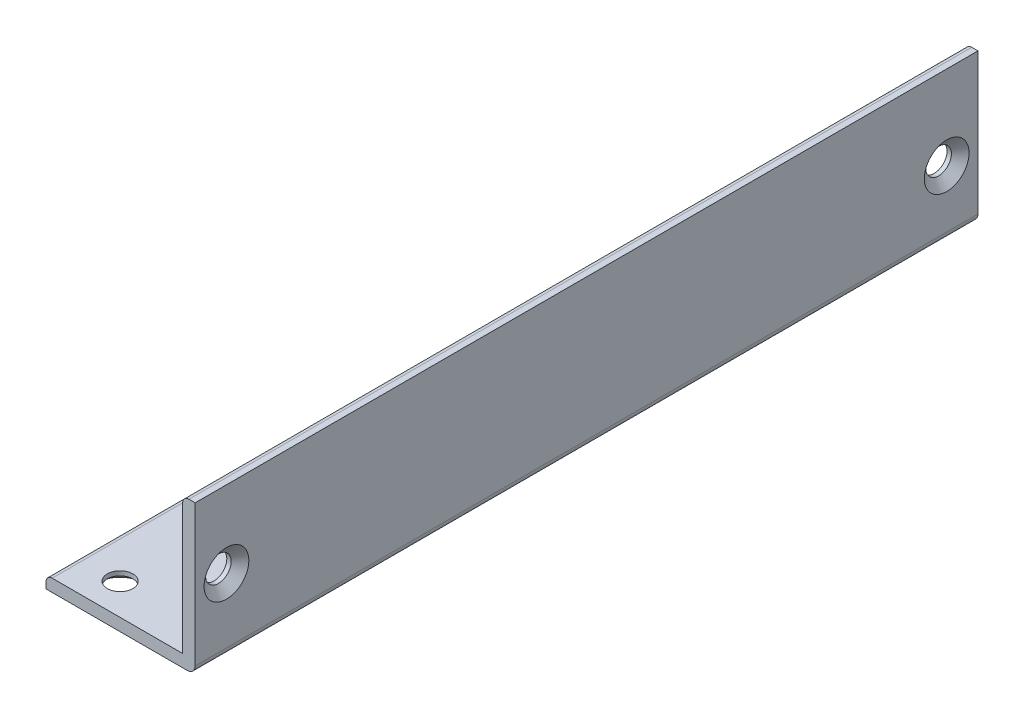
ISO-10303-21;
HEADER;
FILE_DESCRIPTION(('STEP AP214'),'2;1');
FILE_NAME('part.step','',(''),(''),'','','');
FILE_SCHEMA(('AUTOMOTIVE_DESIGN { 1 0 10303 214 1 1 1 1 }'));
ENDSEC;
DATA;
#1=APPLICATION_CONTEXT('core data for automotive mechanical design processes');
#2=APPLICATION_PROTOCOL_DEFINITION('international standard','automotive_design',2000,#1);
#3=PRODUCT_CONTEXT('',#1,'mechanical');
#4=PRODUCT('Part','Part','',(#3));
#5=PRODUCT_RELATED_PRODUCT_CATEGORY('part','',(#4));
#6=PRODUCT_DEFINITION_FORMATION('','',#4);
#7=PRODUCT_DEFINITION_CONTEXT('part definition',#1,'design');
#8=PRODUCT_DEFINITION('design','',#6,#7);
#9=PRODUCT_DEFINITION_SHAPE('','',#8);
#10=(LENGTH_UNIT() NAMED_UNIT(*) SI_UNIT(.MILLI.,.METRE.));
#11=(NAMED_UNIT(*) PLANE_ANGLE_UNIT() SI_UNIT($,.RADIAN.));
#12=(NAMED_UNIT(*) SI_UNIT($,.STERADIAN.) SOLID_ANGLE_UNIT());
#13=UNCERTAINTY_MEASURE_WITH_UNIT(LENGTH_MEASURE(1.E-05),#10,'distance_accuracy_value','');
#14=(GEOMETRIC_REPRESENTATION_CONTEXT(3) GLOBAL_UNCERTAINTY_ASSIGNED_CONTEXT((#13)) GLOBAL_UNIT_ASSIGNED_CONTEXT((#10,
#11,#12)) REPRESENTATION_CONTEXT('',''));
#15=CARTESIAN_POINT('',(0.,0.,0.));
#16=DIRECTION('',(0.,0.,1.));
#17=DIRECTION('',(1.,0.,0.));
#18=AXIS2_PLACEMENT_3D('',#15,#16,#17);
#19=CARTESIAN_POINT('',(8.73124999999998,18.25625,50.));
#20=DIRECTION('',(0.,0.,-1.));
#21=DIRECTION('',(-1.,0.,0.));
#22=AXIS2_PLACEMENT_3D('',#19,#20,#21);
#23=PLANE('',#22);
#24=DIRECTION('',(0.,-1.,0.));
#25=VECTOR('',#24,1.);
#26=CARTESIAN_POINT('',(7.93749999999998,18.25625,50.));
#27=LINE('',#26,#25);
#28=CARTESIAN_POINT('',(7.93749999999998,18.25625,50.));
#29=VERTEX_POINT('',#28);
#30=CARTESIAN_POINT('',(7.93749999999998,1.5875,50.));
#31=VERTEX_POINT('',#30);
#32=EDGE_CURVE('E235',#29,#31,#27,.T.);
#33=ORIENTED_EDGE('',*,*,#32,.T.);
#34=DIRECTION('',(-1.,0.,0.));
#35=VECTOR('',#34,1.);
#36=CARTESIAN_POINT('',(7.14374999999999,1.5875,50.));
#37=LINE('',#36,#35);
#38=CARTESIAN_POINT('',(-8.73125000000002,1.5875,50.));
#39=VERTEX_POINT('',#38);
#40=EDGE_CURVE('E157',#31,#39,#37,.T.);
#41=ORIENTED_EDGE('',*,*,#40,.T.);
#42=CARTESIAN_POINT('',(-8.73125000000002,0.793749999999998,50.));
#43=DIRECTION('',(0.,0.,1.));
#44=DIRECTION('',(-1.,0.,0.));
#45=AXIS2_PLACEMENT_3D('',#42,#43,#44);
#46=CIRCLE('',#45,0.793749999999998);
#47=CARTESIAN_POINT('',(-9.52500000000002,0.793749999999998,50.));
#48=VERTEX_POINT('',#47);
#49=EDGE_CURVE('E238',#39,#48,#46,.T.);
#50=ORIENTED_EDGE('',*,*,#49,.T.);
#51=DIRECTION('',(0.,-1.,0.));
#52=VECTOR('',#51,1.);
#53=CARTESIAN_POINT('',(-9.52500000000002,0.793749999999998,50.));
#54=LINE('',#53,#52);
#55=CARTESIAN_POINT('',(-9.52500000000002,0.,50.));
#56=VERTEX_POINT('',#55);
#57=EDGE_CURVE('E219',#48,#56,#54,.T.);
#58=ORIENTED_EDGE('',*,*,#57,.T.);
#59=DIRECTION('',(1.,0.,0.));
#60=VECTOR('',#59,1.);
#61=CARTESIAN_POINT('',(-9.52500000000002,0.,50.));
#62=LINE('',#61,#60);
#63=CARTESIAN_POINT('',(8.52499999999998,0.,50.));
#64=VERTEX_POINT('',#63);
#65=EDGE_CURVE('E222',#56,#64,#62,.T.);
#66=ORIENTED_EDGE('',*,*,#65,.T.);
#67=CARTESIAN_POINT('',(8.52499999999998,1.,50.));
#68=DIRECTION('',(0.,0.,-1.));
#69=DIRECTION('',(-1.,0.,0.));
#70=AXIS2_PLACEMENT_3D('',#67,#68,#69);
#71=CIRCLE('',#70,1.);
#72=CARTESIAN_POINT('',(9.52499999999998,1.,50.));
#73=VERTEX_POINT('',#72);
#74=EDGE_CURVE('E12',#64,#73,#71,.F.);
#75=ORIENTED_EDGE('',*,*,#74,.T.);
#76=DIRECTION('',(0.,1.,0.));
#77=VECTOR('',#76,1.);
#78=CARTESIAN_POINT('',(9.52499999999998,0.,50.));
#79=LINE('',#78,#77);
#80=CARTESIAN_POINT('',(9.52499999999998,19.05,50.));
#81=VERTEX_POINT('',#80);
#82=EDGE_CURVE('E226',#73,#81,#79,.T.);
#83=ORIENTED_EDGE('',*,*,#82,.T.);
#84=DIRECTION('',(-1.,0.,0.));
#85=VECTOR('',#84,1.);
#86=CARTESIAN_POINT('',(8.73124999999998,19.05,50.));
#87=LINE('',#86,#85);
#88=CARTESIAN_POINT('',(8.73124999999998,19.05,50.));
#89=VERTEX_POINT('',#88);
#90=EDGE_CURVE('E229',#81,#89,#87,.T.);
#91=ORIENTED_EDGE('',*,*,#90,.T.);
#92=CARTESIAN_POINT('',(8.73124999999998,18.25625,50.));
#93=DIRECTION('',(0.,0.,1.));
#94=DIRECTION('',(-1.,0.,0.));
#95=AXIS2_PLACEMENT_3D('',#92,#93,#94);
#96=CIRCLE('',#95,0.793749999999999);
#97=EDGE_CURVE('E232',#89,#29,#96,.T.);
#98=ORIENTED_EDGE('',*,*,#97,.T.);
#99=EDGE_LOOP('',(#33,#41,#50,#58,#66,#75,#83,#91,#98));
#100=FACE_BOUND('',#99,.T.);
#101=ADVANCED_FACE('F44',(#100),#23,.F.);
#102=CARTESIAN_POINT('',(-9.52500000000002,0.793749999999998,50.));
#103=DIRECTION('',(1.,0.,0.));
#104=DIRECTION('',(0.,0.,-1.));
#105=AXIS2_PLACEMENT_3D('',#102,#103,#104);
#106=PLANE('',#105);
#107=DIRECTION('',(0.,-1.,0.));
#108=VECTOR('',#107,1.);
#109=CARTESIAN_POINT('',(-9.52499999999998,0.793749999999998,-50.));
#110=LINE('',#109,#108);
#111=CARTESIAN_POINT('',(-9.52499999999998,0.793749999999998,-50.));
#112=VERTEX_POINT('',#111);
#113=CARTESIAN_POINT('',(-9.52499999999998,0.,-50.));
#114=VERTEX_POINT('',#113);
#115=EDGE_CURVE('E242',#112,#114,#110,.T.);
#116=ORIENTED_EDGE('',*,*,#115,.T.);
#117=DIRECTION('',(0.,0.,-1.));
#118=VECTOR('',#117,1.);
#119=CARTESIAN_POINT('',(-9.52500000000002,0.,50.));
#120=LINE('',#119,#118);
#121=EDGE_CURVE('E280',#56,#114,#120,.T.);
#122=ORIENTED_EDGE('',*,*,#121,.F.);
#123=ORIENTED_EDGE('',*,*,#57,.F.);
#124=DIRECTION('',(0.,0.,-1.));
#125=VECTOR('',#124,1.);
#126=CARTESIAN_POINT('',(-9.52500000000002,0.793749999999998,50.));
#127=LINE('',#126,#125);
#128=EDGE_CURVE('E241',#48,#112,#127,.T.);
#129=ORIENTED_EDGE('',*,*,#128,.T.);
#130=EDGE_LOOP('',(#116,#122,#123,#129));
#131=FACE_BOUND('',#130,.T.);
#132=ADVANCED_FACE('F308',(#131),#106,.F.);
#133=CARTESIAN_POINT('',(-9.52500000000002,0.,50.));
#134=DIRECTION('',(0.,1.,0.));
#135=DIRECTION('',(0.,0.,1.));
#136=AXIS2_PLACEMENT_3D('',#133,#134,#135);
#137=PLANE('',#136);
#138=CARTESIAN_POINT('',(3.49374999999999,0.,29.88));
#139=DIRECTION('',(0.,1.,0.));
#140=DIRECTION('',(0.,0.,1.));
#141=AXIS2_PLACEMENT_3D('',#138,#139,#140);
#142=CIRCLE('',#141,2.0574);
#143=CARTESIAN_POINT('',(3.49374999999999,0.,31.9374));
#144=VERTEX_POINT('',#143);
#145=EDGE_CURVE('E173',#144,#144,#142,.T.);
#146=ORIENTED_EDGE('',*,*,#145,.T.);
#147=EDGE_LOOP('',(#146));
#148=FACE_BOUND('',#147,.T.);
#149=CARTESIAN_POINT('',(-1.30625000000001,0.,29.88));
#150=DIRECTION('',(0.,1.,0.));
#151=DIRECTION('',(0.,0.,1.));
#152=AXIS2_PLACEMENT_3D('',#149,#150,#151);
#153=CIRCLE('',#152,2.0574);
#154=CARTESIAN_POINT('',(-1.30625000000001,0.,31.9374));
#155=VERTEX_POINT('',#154);
#156=EDGE_CURVE('E182',#155,#155,#153,.T.);
#157=ORIENTED_EDGE('',*,*,#156,.T.);
#158=EDGE_LOOP('',(#157));
#159=FACE_BOUND('',#158,.T.);
#160=CARTESIAN_POINT('',(-4.06250000000003,0.,46.));
#161=DIRECTION('',(0.,-1.,0.));
#162=DIRECTION('',(0.,0.,-1.));
#163=AXIS2_PLACEMENT_3D('',#160,#161,#162);
#164=CIRCLE('',#163,2.8575);
#165=CARTESIAN_POINT('',(-4.06250000000002,0.,43.1425));
#166=VERTEX_POINT('',#165);
#167=EDGE_CURVE('E205',#166,#166,#164,.T.);
#168=ORIENTED_EDGE('',*,*,#167,.F.);
#169=EDGE_LOOP('',(#168));
#170=FACE_BOUND('',#169,.T.);
#171=CARTESIAN_POINT('',(-4.06249999999998,0.,-46.));
#172=DIRECTION('',(0.,-1.,0.));
#173=DIRECTION('',(0.,0.,-1.));
#174=AXIS2_PLACEMENT_3D('',#171,#172,#173);
#175=CIRCLE('',#174,2.8575);
#176=CARTESIAN_POINT('',(-4.06249999999998,0.,-48.8575));
#177=VERTEX_POINT('',#176);
#178=EDGE_CURVE('E212',#177,#177,#175,.T.);
#179=ORIENTED_EDGE('',*,*,#178,.F.);
#180=EDGE_LOOP('',(#179));
#181=FACE_BOUND('',#180,.T.);
#182=DIRECTION('',(1.,0.,0.));
#183=VECTOR('',#182,1.);
#184=CARTESIAN_POINT('',(-9.52499999999998,0.,-50.));
#185=LINE('',#184,#183);
#186=CARTESIAN_POINT('',(8.52500000000002,0.,-50.));
#187=VERTEX_POINT('',#186);
#188=EDGE_CURVE('E245',#114,#187,#185,.T.);
#189=ORIENTED_EDGE('',*,*,#188,.T.);
#190=DIRECTION('',(0.,0.,-1.));
#191=VECTOR('',#190,1.);
#192=CARTESIAN_POINT('',(8.52499999999998,0.,50.));
#193=LINE('',#192,#191);
#194=EDGE_CURVE('E52',#187,#64,#193,.F.);
#195=ORIENTED_EDGE('',*,*,#194,.T.);
#196=ORIENTED_EDGE('',*,*,#65,.F.);
#197=ORIENTED_EDGE('',*,*,#121,.T.);
#198=EDGE_LOOP('',(#189,#195,#196,#197));
#199=FACE_BOUND('',#198,.T.);
#200=ADVANCED_FACE('F305',(#148,#159,#170,#181,#199),#137,.F.);
#201=CARTESIAN_POINT('',(9.52499999999998,0.,50.));
#202=DIRECTION('',(-1.,0.,0.));
#203=DIRECTION('',(0.,0.,1.));
#204=AXIS2_PLACEMENT_3D('',#201,#202,#203);
#205=PLANE('',#204);
#206=CARTESIAN_POINT('',(9.52499999999998,9.25,46.));
#207=DIRECTION('',(1.,0.,0.));
#208=DIRECTION('',(0.,0.,-1.));
#209=AXIS2_PLACEMENT_3D('',#206,#207,#208);
#210=CIRCLE('',#209,2.8575);
#211=CARTESIAN_POINT('',(9.52499999999998,9.25,43.1425));
#212=VERTEX_POINT('',#211);
#213=EDGE_CURVE('E191',#212,#212,#210,.T.);
#214=ORIENTED_EDGE('',*,*,#213,.F.);
#215=EDGE_LOOP('',(#214));
#216=FACE_BOUND('',#215,.T.);
#217=CARTESIAN_POINT('',(9.52500000000002,8.34,-46.));
#218=DIRECTION('',(1.,0.,0.));
#219=DIRECTION('',(0.,0.,-1.));
#220=AXIS2_PLACEMENT_3D('',#217,#218,#219);
#221=CIRCLE('',#220,2.8575);
#222=CARTESIAN_POINT('',(9.52500000000002,8.34,-48.8575));
#223=VERTEX_POINT('',#222);
#224=EDGE_CURVE('E198',#223,#223,#221,.T.);
#225=ORIENTED_EDGE('',*,*,#224,.F.);
#226=EDGE_LOOP('',(#225));
#227=FACE_BOUND('',#226,.T.);
#228=ORIENTED_EDGE('',*,*,#82,.F.);
#229=DIRECTION('',(0.,0.,-1.));
#230=VECTOR('',#229,1.);
#231=CARTESIAN_POINT('',(9.52499999999998,1.,50.));
#232=LINE('',#231,#230);
#233=CARTESIAN_POINT('',(9.52500000000002,1.,-50.));
#234=VERTEX_POINT('',#233);
#235=EDGE_CURVE('E283',#73,#234,#232,.T.);
#236=ORIENTED_EDGE('',*,*,#235,.T.);
#237=DIRECTION('',(0.,1.,0.));
#238=VECTOR('',#237,1.);
#239=CARTESIAN_POINT('',(9.52500000000002,0.,-50.));
#240=LINE('',#239,#238);
#241=CARTESIAN_POINT('',(9.52500000000002,19.05,-50.));
#242=VERTEX_POINT('',#241);
#243=EDGE_CURVE('E247',#234,#242,#240,.T.);
#244=ORIENTED_EDGE('',*,*,#243,.T.);
#245=DIRECTION('',(0.,0.,-1.));
#246=VECTOR('',#245,1.);
#247=CARTESIAN_POINT('',(9.52499999999998,19.05,50.));
#248=LINE('',#247,#246);
#249=EDGE_CURVE('E277',#81,#242,#248,.T.);
#250=ORIENTED_EDGE('',*,*,#249,.F.);
#251=EDGE_LOOP('',(#228,#236,#244,#250));
#252=FACE_BOUND('',#251,.T.);
#253=ADVANCED_FACE('F296',(#216,#227,#252),#205,.F.);
#254=CARTESIAN_POINT('',(8.73124999999998,19.05,50.));
#255=DIRECTION('',(0.,-1.,0.));
#256=DIRECTION('',(0.,0.,-1.));
#257=AXIS2_PLACEMENT_3D('',#254,#255,#256);
#258=PLANE('',#257);
#259=DIRECTION('',(-1.,0.,0.));
#260=VECTOR('',#259,1.);
#261=CARTESIAN_POINT('',(8.73125000000002,19.05,-50.));
#262=LINE('',#261,#260);
#263=CARTESIAN_POINT('',(8.73125000000002,19.05,-50.));
#264=VERTEX_POINT('',#263);
#265=EDGE_CURVE('E250',#242,#264,#262,.T.);
#266=ORIENTED_EDGE('',*,*,#265,.T.);
#267=DIRECTION('',(0.,0.,-1.));
#268=VECTOR('',#267,1.);
#269=CARTESIAN_POINT('',(8.73124999999998,19.05,50.));
#270=LINE('',#269,#268);
#271=EDGE_CURVE('E274',#89,#264,#270,.T.);
#272=ORIENTED_EDGE('',*,*,#271,.F.);
#273=ORIENTED_EDGE('',*,*,#90,.F.);
#274=ORIENTED_EDGE('',*,*,#249,.T.);
#275=EDGE_LOOP('',(#266,#272,#273,#274));
#276=FACE_BOUND('',#275,.T.);
#277=ADVANCED_FACE('F301',(#276),#258,.F.);
#278=CARTESIAN_POINT('',(8.73124999999998,18.25625,50.));
#279=DIRECTION('',(0.,0.,-1.));
#280=DIRECTION('',(-1.,0.,0.));
#281=AXIS2_PLACEMENT_3D('',#278,#279,#280);
#282=CYLINDRICAL_SURFACE('',#281,0.793749999999999);
#283=CARTESIAN_POINT('',(8.73125000000002,18.25625,-50.));
#284=DIRECTION('',(0.,0.,1.));
#285=DIRECTION('',(-1.,0.,0.));
#286=AXIS2_PLACEMENT_3D('',#283,#284,#285);
#287=CIRCLE('',#286,0.793749999999999);
#288=CARTESIAN_POINT('',(7.93750000000002,18.25625,-50.));
#289=VERTEX_POINT('',#288);
#290=EDGE_CURVE('E253',#264,#289,#287,.T.);
#291=ORIENTED_EDGE('',*,*,#290,.T.);
#292=DIRECTION('',(0.,0.,-1.));
#293=VECTOR('',#292,1.);
#294=CARTESIAN_POINT('',(7.93749999999998,18.25625,50.));
#295=LINE('',#294,#293);
#296=EDGE_CURVE('E271',#29,#289,#295,.T.);
#297=ORIENTED_EDGE('',*,*,#296,.F.);
#298=ORIENTED_EDGE('',*,*,#97,.F.);
#299=ORIENTED_EDGE('',*,*,#271,.T.);
#300=EDGE_LOOP('',(#291,#297,#298,#299));
#301=FACE_BOUND('',#300,.T.);
#302=ADVANCED_FACE('F314',(#301),#282,.T.);
#303=CARTESIAN_POINT('',(7.93749999999998,18.25625,50.));
#304=DIRECTION('',(1.,0.,0.));
#305=DIRECTION('',(0.,1.,0.));
#306=AXIS2_PLACEMENT_3D('',#303,#304,#305);
#307=PLANE('',#306);
#308=DIRECTION('',(0.,0.,1.));
#309=VECTOR('',#308,1.);
#310=CARTESIAN_POINT('',(7.93749999999999,1.5875,25.));
#311=LINE('',#310,#309);
#312=CARTESIAN_POINT('',(7.93749999999999,1.5875,25.));
#313=VERTEX_POINT('',#312);
#314=EDGE_CURVE('E148',#313,#31,#311,.T.);
#315=ORIENTED_EDGE('',*,*,#314,.T.);
#316=ORIENTED_EDGE('',*,*,#32,.F.);
#317=ORIENTED_EDGE('',*,*,#296,.T.);
#318=DIRECTION('',(0.,-1.,0.));
#319=VECTOR('',#318,1.);
#320=CARTESIAN_POINT('',(7.93750000000002,18.25625,-50.));
#321=LINE('',#320,#319);
#322=CARTESIAN_POINT('',(7.93750000000003,1.5875,-50.));
#323=VERTEX_POINT('',#322);
#324=EDGE_CURVE('E256',#289,#323,#321,.T.);
#325=ORIENTED_EDGE('',*,*,#324,.T.);
#326=DIRECTION('',(0.,0.,-1.));
#327=VECTOR('',#326,1.);
#328=CARTESIAN_POINT('',(7.93750000000002,1.5875,-25.));
#329=LINE('',#328,#327);
#330=CARTESIAN_POINT('',(7.93750000000002,1.5875,-25.));
#331=VERTEX_POINT('',#330);
#332=EDGE_CURVE('E167',#331,#323,#329,.T.);
#333=ORIENTED_EDGE('',*,*,#332,.F.);
#334=DIRECTION('',(0.,-1.,0.));
#335=VECTOR('',#334,1.);
#336=CARTESIAN_POINT('',(7.93750000000002,6.5875,-25.));
#337=LINE('',#336,#335);
#338=CARTESIAN_POINT('',(7.93750000000002,2.38125,-25.));
#339=VERTEX_POINT('',#338);
#340=EDGE_CURVE('E160',#339,#331,#337,.T.);
#341=ORIENTED_EDGE('',*,*,#340,.F.);
#342=DIRECTION('',(0.,0.,-1.));
#343=VECTOR('',#342,1.);
#344=CARTESIAN_POINT('',(7.93749999999999,2.38125,50.));
#345=LINE('',#344,#343);
#346=CARTESIAN_POINT('',(7.93749999999999,2.38125,25.));
#347=VERTEX_POINT('',#346);
#348=EDGE_CURVE('E152',#347,#339,#345,.T.);
#349=ORIENTED_EDGE('',*,*,#348,.F.);
#350=DIRECTION('',(0.,-1.,0.));
#351=VECTOR('',#350,1.);
#352=CARTESIAN_POINT('',(7.93749999999999,6.5875,25.));
#353=LINE('',#352,#351);
#354=EDGE_CURVE('E136',#347,#313,#353,.T.);
#355=ORIENTED_EDGE('',*,*,#354,.T.);
#356=EDGE_LOOP('',(#315,#316,#317,#325,#333,#341,#349,#355));
#357=FACE_BOUND('',#356,.T.);
#358=CARTESIAN_POINT('',(7.93750000000003,8.34,-46.));
#359=DIRECTION('',(1.,0.,0.));
#360=DIRECTION('',(0.,1.,0.));
#361=AXIS2_PLACEMENT_3D('',#358,#359,#360);
#362=CIRCLE('',#361,1.63195);
#363=CARTESIAN_POINT('',(7.93750000000003,9.97195,-46.));
#364=VERTEX_POINT('',#363);
#365=EDGE_CURVE('E204',#364,#364,#362,.T.);
#366=ORIENTED_EDGE('',*,*,#365,.T.);
#367=EDGE_LOOP('',(#366));
#368=FACE_BOUND('',#367,.T.);
#369=CARTESIAN_POINT('',(7.93749999999998,9.25,46.));
#370=DIRECTION('',(1.,0.,0.));
#371=DIRECTION('',(0.,1.,0.));
#372=AXIS2_PLACEMENT_3D('',#369,#370,#371);
#373=CIRCLE('',#372,1.63195);
#374=CARTESIAN_POINT('',(7.93749999999998,10.88195,46.));
#375=VERTEX_POINT('',#374);
#376=EDGE_CURVE('E197',#375,#375,#373,.T.);
#377=ORIENTED_EDGE('',*,*,#376,.T.);
#378=EDGE_LOOP('',(#377));
#379=FACE_BOUND('',#378,.T.);
#380=ADVANCED_FACE('F145',(#357,#368,#379),#307,.F.);
#381=CARTESIAN_POINT('',(7.14374999999999,2.38125,50.));
#382=DIRECTION('',(0.,0.,-1.));
#383=DIRECTION('',(-1.,0.,0.));
#384=AXIS2_PLACEMENT_3D('',#381,#382,#383);
#385=CYLINDRICAL_SURFACE('',#384,0.793749999999999);
#386=DIRECTION('',(0.,0.,-1.));
#387=VECTOR('',#386,1.);
#388=CARTESIAN_POINT('',(7.14374999999999,1.5875,50.));
#389=LINE('',#388,#387);
#390=CARTESIAN_POINT('',(7.14375,1.5875,25.));
#391=VERTEX_POINT('',#390);
#392=CARTESIAN_POINT('',(7.14375000000002,1.5875,-25.));
#393=VERTEX_POINT('',#392);
#394=EDGE_CURVE('E268',#391,#393,#389,.T.);
#395=ORIENTED_EDGE('',*,*,#394,.F.);
#396=CARTESIAN_POINT('',(7.14375,2.38125,25.));
#397=DIRECTION('',(0.,0.,-1.));
#398=DIRECTION('',(-1.,0.,0.));
#399=AXIS2_PLACEMENT_3D('',#396,#397,#398);
#400=CIRCLE('',#399,0.793749999999999);
#401=EDGE_CURVE('E138',#391,#347,#400,.F.);
#402=ORIENTED_EDGE('',*,*,#401,.T.);
#403=ORIENTED_EDGE('',*,*,#348,.T.);
#404=CARTESIAN_POINT('',(7.14375000000002,2.38125,-25.));
#405=DIRECTION('',(0.,0.,1.));
#406=DIRECTION('',(1.,0.,0.));
#407=AXIS2_PLACEMENT_3D('',#404,#405,#406);
#408=CIRCLE('',#407,0.793749999999999);
#409=EDGE_CURVE('E170',#339,#393,#408,.F.);
#410=ORIENTED_EDGE('',*,*,#409,.T.);
#411=EDGE_LOOP('',(#395,#402,#403,#410));
#412=FACE_BOUND('',#411,.T.);
#413=ADVANCED_FACE('F321',(#412),#385,.F.);
#414=CARTESIAN_POINT('',(7.14374999999999,1.5875,50.));
#415=DIRECTION('',(0.,-1.,0.));
#416=DIRECTION('',(1.,0.,0.));
#417=AXIS2_PLACEMENT_3D('',#414,#415,#416);
#418=PLANE('',#417);
#419=CARTESIAN_POINT('',(3.49374999999999,1.5875,29.88));
#420=DIRECTION('',(0.,1.,0.));
#421=DIRECTION('',(0.,0.,1.));
#422=AXIS2_PLACEMENT_3D('',#419,#420,#421);
#423=CIRCLE('',#422,1.21919999999999);
#424=CARTESIAN_POINT('',(3.49374999999999,1.5875,31.0992));
#425=VERTEX_POINT('',#424);
#426=EDGE_CURVE('E176',#425,#425,#423,.T.);
#427=ORIENTED_EDGE('',*,*,#426,.F.);
#428=EDGE_LOOP('',(#427));
#429=FACE_BOUND('',#428,.T.);
#430=DIRECTION('',(0.,0.,-1.));
#431=VECTOR('',#430,1.);
#432=CARTESIAN_POINT('',(-8.73125000000002,1.5875,50.));
#433=LINE('',#432,#431);
#434=CARTESIAN_POINT('',(-8.73124999999998,1.5875,-50.));
#435=VERTEX_POINT('',#434);
#436=EDGE_CURVE('E265',#39,#435,#433,.T.);
#437=ORIENTED_EDGE('',*,*,#436,.F.);
#438=ORIENTED_EDGE('',*,*,#40,.F.);
#439=ORIENTED_EDGE('',*,*,#314,.F.);
#440=DIRECTION('',(-1.,0.,0.));
#441=VECTOR('',#440,1.);
#442=CARTESIAN_POINT('',(2.93749999999999,1.5875,25.));
#443=LINE('',#442,#441);
#444=EDGE_CURVE('E133',#313,#391,#443,.T.);
#445=ORIENTED_EDGE('',*,*,#444,.T.);
#446=ORIENTED_EDGE('',*,*,#394,.T.);
#447=DIRECTION('',(-1.,0.,0.));
#448=VECTOR('',#447,1.);
#449=CARTESIAN_POINT('',(2.93750000000001,1.5875,-25.));
#450=LINE('',#449,#448);
#451=EDGE_CURVE('E165',#331,#393,#450,.T.);
#452=ORIENTED_EDGE('',*,*,#451,.F.);
#453=ORIENTED_EDGE('',*,*,#332,.T.);
#454=DIRECTION('',(-1.,0.,0.));
#455=VECTOR('',#454,1.);
#456=CARTESIAN_POINT('',(7.14375000000003,1.5875,-50.));
#457=LINE('',#456,#455);
#458=EDGE_CURVE('E259',#323,#435,#457,.T.);
#459=ORIENTED_EDGE('',*,*,#458,.T.);
#460=EDGE_LOOP('',(#437,#438,#439,#445,#446,#452,#453,#459));
#461=FACE_BOUND('',#460,.T.);
#462=CARTESIAN_POINT('',(-4.06249999999998,1.5875,-46.));
#463=DIRECTION('',(0.,-1.,0.));
#464=DIRECTION('',(1.,0.,0.));
#465=AXIS2_PLACEMENT_3D('',#462,#463,#464);
#466=CIRCLE('',#465,1.63195);
#467=CARTESIAN_POINT('',(-2.43054999999998,1.5875,-46.));
#468=VERTEX_POINT('',#467);
#469=EDGE_CURVE('E218',#468,#468,#466,.T.);
#470=ORIENTED_EDGE('',*,*,#469,.T.);
#471=EDGE_LOOP('',(#470));
#472=FACE_BOUND('',#471,.T.);
#473=CARTESIAN_POINT('',(-4.06250000000003,1.5875,46.));
#474=DIRECTION('',(0.,-1.,0.));
#475=DIRECTION('',(1.,0.,0.));
#476=AXIS2_PLACEMENT_3D('',#473,#474,#475);
#477=CIRCLE('',#476,1.63195);
#478=CARTESIAN_POINT('',(-2.43055000000003,1.5875,46.));
#479=VERTEX_POINT('',#478);
#480=EDGE_CURVE('E211',#479,#479,#477,.T.);
#481=ORIENTED_EDGE('',*,*,#480,.T.);
#482=EDGE_LOOP('',(#481));
#483=FACE_BOUND('',#482,.T.);
#484=CARTESIAN_POINT('',(-1.30625000000001,1.5875,29.88));
#485=DIRECTION('',(0.,1.,0.));
#486=DIRECTION('',(0.,0.,1.));
#487=AXIS2_PLACEMENT_3D('',#484,#485,#486);
#488=CIRCLE('',#487,1.21919999999999);
#489=CARTESIAN_POINT('',(-1.30625000000001,1.5875,31.0992));
#490=VERTEX_POINT('',#489);
#491=EDGE_CURVE('E185',#490,#490,#488,.T.);
#492=ORIENTED_EDGE('',*,*,#491,.F.);
#493=EDGE_LOOP('',(#492));
#494=FACE_BOUND('',#493,.T.);
#495=ADVANCED_FACE('F154',(#429,#461,#472,#483,#494),#418,.F.);
#496=CARTESIAN_POINT('',(-8.73125000000002,0.793749999999998,50.));
#497=DIRECTION('',(0.,0.,-1.));
#498=DIRECTION('',(-1.,0.,0.));
#499=AXIS2_PLACEMENT_3D('',#496,#497,#498);
#500=CYLINDRICAL_SURFACE('',#499,0.793749999999998);
#501=CARTESIAN_POINT('',(-8.73124999999998,0.793749999999998,-50.));
#502=DIRECTION('',(0.,0.,1.));
#503=DIRECTION('',(-1.,0.,0.));
#504=AXIS2_PLACEMENT_3D('',#501,#502,#503);
#505=CIRCLE('',#504,0.793749999999998);
#506=EDGE_CURVE('E223',#435,#112,#505,.T.);
#507=ORIENTED_EDGE('',*,*,#506,.T.);
#508=ORIENTED_EDGE('',*,*,#128,.F.);
#509=ORIENTED_EDGE('',*,*,#49,.F.);
#510=ORIENTED_EDGE('',*,*,#436,.T.);
#511=EDGE_LOOP('',(#507,#508,#509,#510));
#512=FACE_BOUND('',#511,.T.);
#513=ADVANCED_FACE('F312',(#512),#500,.T.);
#514=CARTESIAN_POINT('',(8.73125000000002,18.25625,-50.));
#515=DIRECTION('',(0.,0.,-1.));
#516=DIRECTION('',(-1.,0.,0.));
#517=AXIS2_PLACEMENT_3D('',#514,#515,#516);
#518=PLANE('',#517);
#519=ORIENTED_EDGE('',*,*,#458,.F.);
#520=ORIENTED_EDGE('',*,*,#324,.F.);
#521=ORIENTED_EDGE('',*,*,#290,.F.);
#522=ORIENTED_EDGE('',*,*,#265,.F.);
#523=ORIENTED_EDGE('',*,*,#243,.F.);
#524=CARTESIAN_POINT('',(8.52500000000002,1.,-50.));
#525=DIRECTION('',(0.,0.,-1.));
#526=DIRECTION('',(-1.,0.,0.));
#527=AXIS2_PLACEMENT_3D('',#524,#525,#526);
#528=CIRCLE('',#527,1.);
#529=EDGE_CURVE('E66',#234,#187,#528,.T.);
#530=ORIENTED_EDGE('',*,*,#529,.T.);
#531=ORIENTED_EDGE('',*,*,#188,.F.);
#532=ORIENTED_EDGE('',*,*,#115,.F.);
#533=ORIENTED_EDGE('',*,*,#506,.F.);
#534=EDGE_LOOP('',(#519,#520,#521,#522,#523,#530,#531,#532,#533));
#535=FACE_BOUND('',#534,.T.);
#536=ADVANCED_FACE('F298',(#535),#518,.T.);
#537=CARTESIAN_POINT('',(-4.06249999999998,0.,-46.));
#538=DIRECTION('',(0.,-1.,0.));
#539=DIRECTION('',(0.,0.,-1.));
#540=AXIS2_PLACEMENT_3D('',#537,#538,#539);
#541=CYLINDRICAL_SURFACE('',#540,1.63195);
#542=CARTESIAN_POINT('',(-4.06249999999998,1.02835855298932,-46.));
#543=DIRECTION('',(0.,-1.,0.));
#544=DIRECTION('',(0.,0.,-1.));
#545=AXIS2_PLACEMENT_3D('',#542,#543,#544);
#546=CIRCLE('',#545,1.63195);
#547=CARTESIAN_POINT('',(-4.06249999999998,1.02835855298932,-47.63195));
#548=VERTEX_POINT('',#547);
#549=EDGE_CURVE('E215',#548,#548,#546,.T.);
#550=ORIENTED_EDGE('',*,*,#549,.T.);
#551=EDGE_LOOP('',(#550));
#552=FACE_BOUND('',#551,.T.);
#553=ORIENTED_EDGE('',*,*,#469,.F.);
#554=EDGE_LOOP('',(#553));
#555=FACE_BOUND('',#554,.T.);
#556=ADVANCED_FACE('F331',(#552,#555),#541,.F.);
#557=CARTESIAN_POINT('',(-4.06249999999998,0.,-46.));
#558=DIRECTION('',(0.,-1.,0.));
#559=DIRECTION('',(0.,0.,-1.));
#560=AXIS2_PLACEMENT_3D('',#557,#558,#559);
#561=CONICAL_SURFACE('',#560,2.8575,0.872664625997165);
#562=ORIENTED_EDGE('',*,*,#549,.F.);
#563=EDGE_LOOP('',(#562));
#564=FACE_BOUND('',#563,.T.);
#565=ORIENTED_EDGE('',*,*,#178,.T.);
#566=EDGE_LOOP('',(#565));
#567=FACE_BOUND('',#566,.T.);
#568=ADVANCED_FACE('F391',(#564,#567),#561,.F.);
#569=CARTESIAN_POINT('',(-4.06250000000003,0.,46.));
#570=DIRECTION('',(0.,-1.,0.));
#571=DIRECTION('',(0.,0.,-1.));
#572=AXIS2_PLACEMENT_3D('',#569,#570,#571);
#573=CYLINDRICAL_SURFACE('',#572,1.63195);
#574=CARTESIAN_POINT('',(-4.06250000000003,1.02835855298932,46.));
#575=DIRECTION('',(0.,-1.,0.));
#576=DIRECTION('',(0.,0.,-1.));
#577=AXIS2_PLACEMENT_3D('',#574,#575,#576);
#578=CIRCLE('',#577,1.63195);
#579=CARTESIAN_POINT('',(-4.06250000000002,1.02835855298932,44.36805));
#580=VERTEX_POINT('',#579);
#581=EDGE_CURVE('E208',#580,#580,#578,.T.);
#582=ORIENTED_EDGE('',*,*,#581,.T.);
#583=EDGE_LOOP('',(#582));
#584=FACE_BOUND('',#583,.T.);
#585=ORIENTED_EDGE('',*,*,#480,.F.);
#586=EDGE_LOOP('',(#585));
#587=FACE_BOUND('',#586,.T.);
#588=ADVANCED_FACE('F388',(#584,#587),#573,.F.);
#589=CARTESIAN_POINT('',(-4.06250000000003,0.,46.));
#590=DIRECTION('',(0.,-1.,0.));
#591=DIRECTION('',(0.,0.,-1.));
#592=AXIS2_PLACEMENT_3D('',#589,#590,#591);
#593=CONICAL_SURFACE('',#592,2.8575,0.872664625997165);
#594=ORIENTED_EDGE('',*,*,#581,.F.);
#595=EDGE_LOOP('',(#594));
#596=FACE_BOUND('',#595,.T.);
#597=ORIENTED_EDGE('',*,*,#167,.T.);
#598=EDGE_LOOP('',(#597));
#599=FACE_BOUND('',#598,.T.);
#600=ADVANCED_FACE('F384',(#596,#599),#593,.F.);
#601=CARTESIAN_POINT('',(9.52500000000002,8.34,-46.));
#602=DIRECTION('',(1.,0.,0.));
#603=DIRECTION('',(0.,0.,-1.));
#604=AXIS2_PLACEMENT_3D('',#601,#602,#603);
#605=CYLINDRICAL_SURFACE('',#604,1.63195);
#606=CARTESIAN_POINT('',(8.4966414470107,8.34,-46.));
#607=DIRECTION('',(1.,0.,0.));
#608=DIRECTION('',(0.,0.,-1.));
#609=AXIS2_PLACEMENT_3D('',#606,#607,#608);
#610=CIRCLE('',#609,1.63195);
#611=CARTESIAN_POINT('',(8.4966414470107,8.34,-47.63195));
#612=VERTEX_POINT('',#611);
#613=EDGE_CURVE('E201',#612,#612,#610,.T.);
#614=ORIENTED_EDGE('',*,*,#613,.T.);
#615=EDGE_LOOP('',(#614));
#616=FACE_BOUND('',#615,.T.);
#617=ORIENTED_EDGE('',*,*,#365,.F.);
#618=EDGE_LOOP('',(#617));
#619=FACE_BOUND('',#618,.T.);
#620=ADVANCED_FACE('F380',(#616,#619),#605,.F.);
#621=CARTESIAN_POINT('',(9.52500000000002,8.34,-46.));
#622=DIRECTION('',(1.,0.,0.));
#623=DIRECTION('',(0.,0.,-1.));
#624=AXIS2_PLACEMENT_3D('',#621,#622,#623);
#625=CONICAL_SURFACE('',#624,2.8575,0.872664625997165);
#626=ORIENTED_EDGE('',*,*,#613,.F.);
#627=EDGE_LOOP('',(#626));
#628=FACE_BOUND('',#627,.T.);
#629=ORIENTED_EDGE('',*,*,#224,.T.);
#630=EDGE_LOOP('',(#629));
#631=FACE_BOUND('',#630,.T.);
#632=ADVANCED_FACE('F376',(#628,#631),#625,.F.);
#633=CARTESIAN_POINT('',(9.52499999999998,9.25,46.));
#634=DIRECTION('',(1.,0.,0.));
#635=DIRECTION('',(0.,0.,-1.));
#636=AXIS2_PLACEMENT_3D('',#633,#634,#635);
#637=CYLINDRICAL_SURFACE('',#636,1.63195);
#638=CARTESIAN_POINT('',(8.49664144701066,9.25,46.));
#639=DIRECTION('',(1.,0.,0.));
#640=DIRECTION('',(0.,0.,-1.));
#641=AXIS2_PLACEMENT_3D('',#638,#639,#640);
#642=CIRCLE('',#641,1.63195);
#643=CARTESIAN_POINT('',(8.49664144701066,9.25,44.36805));
#644=VERTEX_POINT('',#643);
#645=EDGE_CURVE('E194',#644,#644,#642,.T.);
#646=ORIENTED_EDGE('',*,*,#645,.T.);
#647=EDGE_LOOP('',(#646));
#648=FACE_BOUND('',#647,.T.);
#649=ORIENTED_EDGE('',*,*,#376,.F.);
#650=EDGE_LOOP('',(#649));
#651=FACE_BOUND('',#650,.T.);
#652=ADVANCED_FACE('F372',(#648,#651),#637,.F.);
#653=CARTESIAN_POINT('',(9.52499999999998,9.25,46.));
#654=DIRECTION('',(1.,0.,0.));
#655=DIRECTION('',(0.,0.,-1.));
#656=AXIS2_PLACEMENT_3D('',#653,#654,#655);
#657=CONICAL_SURFACE('',#656,2.8575,0.872664625997165);
#658=ORIENTED_EDGE('',*,*,#645,.F.);
#659=EDGE_LOOP('',(#658));
#660=FACE_BOUND('',#659,.T.);
#661=ORIENTED_EDGE('',*,*,#213,.T.);
#662=EDGE_LOOP('',(#661));
#663=FACE_BOUND('',#662,.T.);
#664=ADVANCED_FACE('F369',(#660,#663),#657,.F.);
#665=CARTESIAN_POINT('',(8.52499999999998,1.,50.));
#666=DIRECTION('',(0.,0.,-1.));
#667=DIRECTION('',(-1.,0.,0.));
#668=AXIS2_PLACEMENT_3D('',#665,#666,#667);
#669=CYLINDRICAL_SURFACE('',#668,1.);
#670=ORIENTED_EDGE('',*,*,#74,.F.);
#671=ORIENTED_EDGE('',*,*,#194,.F.);
#672=ORIENTED_EDGE('',*,*,#529,.F.);
#673=ORIENTED_EDGE('',*,*,#235,.F.);
#674=EDGE_LOOP('',(#670,#671,#672,#673));
#675=FACE_BOUND('',#674,.T.);
#676=ADVANCED_FACE('F46',(#675),#669,.T.);
#677=CARTESIAN_POINT('',(-1.30625000000001,0.964238798932652,29.88));
#678=DIRECTION('',(0.,-1.,0.));
#679=DIRECTION('',(0.,0.,-1.));
#680=AXIS2_PLACEMENT_3D('',#677,#678,#679);
#681=CONICAL_SURFACE('',#680,1.2192,0.715584993317675);
#682=ORIENTED_EDGE('',*,*,#156,.F.);
#683=EDGE_LOOP('',(#682));
#684=FACE_BOUND('',#683,.T.);
#685=CARTESIAN_POINT('',(-1.30625000000001,0.964238798932652,29.88));
#686=DIRECTION('',(0.,1.,0.));
#687=DIRECTION('',(0.,0.,1.));
#688=AXIS2_PLACEMENT_3D('',#685,#686,#687);
#689=CIRCLE('',#688,1.2192);
#690=CARTESIAN_POINT('',(-1.30625000000001,0.964238798932652,31.0992));
#691=VERTEX_POINT('',#690);
#692=EDGE_CURVE('E188',#691,#691,#689,.T.);
#693=ORIENTED_EDGE('',*,*,#692,.T.);
#694=EDGE_LOOP('',(#693));
#695=FACE_BOUND('',#694,.T.);
#696=ADVANCED_FACE('F364',(#684,#695),#681,.F.);
#697=CARTESIAN_POINT('',(-1.30625000000001,1.5875,29.88));
#698=DIRECTION('',(0.,1.,0.));
#699=DIRECTION('',(0.,0.,1.));
#700=AXIS2_PLACEMENT_3D('',#697,#698,#699);
#701=CYLINDRICAL_SURFACE('',#700,1.21919999999999);
#702=ORIENTED_EDGE('',*,*,#692,.F.);
#703=EDGE_LOOP('',(#702));
#704=FACE_BOUND('',#703,.T.);
#705=ORIENTED_EDGE('',*,*,#491,.T.);
#706=EDGE_LOOP('',(#705));
#707=FACE_BOUND('',#706,.T.);
#708=ADVANCED_FACE('F360',(#704,#707),#701,.F.);
#709=CARTESIAN_POINT('',(3.49374999999999,0.964238798932652,29.88));
#710=DIRECTION('',(0.,-1.,0.));
#711=DIRECTION('',(0.,0.,-1.));
#712=AXIS2_PLACEMENT_3D('',#709,#710,#711);
#713=CONICAL_SURFACE('',#712,1.2192,0.715584993317675);
#714=ORIENTED_EDGE('',*,*,#145,.F.);
#715=EDGE_LOOP('',(#714));
#716=FACE_BOUND('',#715,.T.);
#717=CARTESIAN_POINT('',(3.49374999999999,0.964238798932652,29.88));
#718=DIRECTION('',(0.,1.,0.));
#719=DIRECTION('',(0.,0.,1.));
#720=AXIS2_PLACEMENT_3D('',#717,#718,#719);
#721=CIRCLE('',#720,1.2192);
#722=CARTESIAN_POINT('',(3.49374999999999,0.964238798932652,31.0992));
#723=VERTEX_POINT('',#722);
#724=EDGE_CURVE('E179',#723,#723,#721,.T.);
#725=ORIENTED_EDGE('',*,*,#724,.T.);
#726=EDGE_LOOP('',(#725));
#727=FACE_BOUND('',#726,.T.);
#728=ADVANCED_FACE('F354',(#716,#727),#713,.F.);
#729=CARTESIAN_POINT('',(3.49374999999999,1.5875,29.88));
#730=DIRECTION('',(0.,1.,0.));
#731=DIRECTION('',(0.,0.,1.));
#732=AXIS2_PLACEMENT_3D('',#729,#730,#731);
#733=CYLINDRICAL_SURFACE('',#732,1.21919999999999);
#734=ORIENTED_EDGE('',*,*,#724,.F.);
#735=EDGE_LOOP('',(#734));
#736=FACE_BOUND('',#735,.T.);
#737=ORIENTED_EDGE('',*,*,#426,.T.);
#738=EDGE_LOOP('',(#737));
#739=FACE_BOUND('',#738,.T.);
#740=ADVANCED_FACE('F347',(#736,#739),#733,.F.);
#741=CARTESIAN_POINT('',(0.,0.,-25.));
#742=DIRECTION('',(0.,0.,1.));
#743=DIRECTION('',(1.,0.,0.));
#744=AXIS2_PLACEMENT_3D('',#741,#742,#743);
#745=PLANE('',#744);
#746=ORIENTED_EDGE('',*,*,#340,.T.);
#747=ORIENTED_EDGE('',*,*,#451,.T.);
#748=ORIENTED_EDGE('',*,*,#409,.F.);
#749=EDGE_LOOP('',(#746,#747,#748));
#750=FACE_BOUND('',#749,.T.);
#751=ADVANCED_FACE('F345',(#750),#745,.F.);
#752=CARTESIAN_POINT('',(0.,0.,25.));
#753=DIRECTION('',(0.,0.,-1.));
#754=DIRECTION('',(1.,0.,0.));
#755=AXIS2_PLACEMENT_3D('',#752,#753,#754);
#756=PLANE('',#755);
#757=ORIENTED_EDGE('',*,*,#444,.F.);
#758=ORIENTED_EDGE('',*,*,#354,.F.);
#759=ORIENTED_EDGE('',*,*,#401,.F.);
#760=EDGE_LOOP('',(#757,#758,#759));
#761=FACE_BOUND('',#760,.T.);
#762=ADVANCED_FACE('F135',(#761),#756,.F.);
#763=CLOSED_SHELL('',(#101,#132,#200,#253,#277,#302,#380,#413,#495,#513,#536,#556,#568,#588,
#600,#620,#632,#652,#664,#676,#696,#708,#728,#740,#751,#762));
#764=MANIFOLD_SOLID_BREP('B2',#763);
#765=ADVANCED_BREP_SHAPE_REPRESENTATION('',(#18,#764),#14);
#766=SHAPE_DEFINITION_REPRESENTATION(#9,#765);
ENDSEC;
END-ISO-10303-21;
